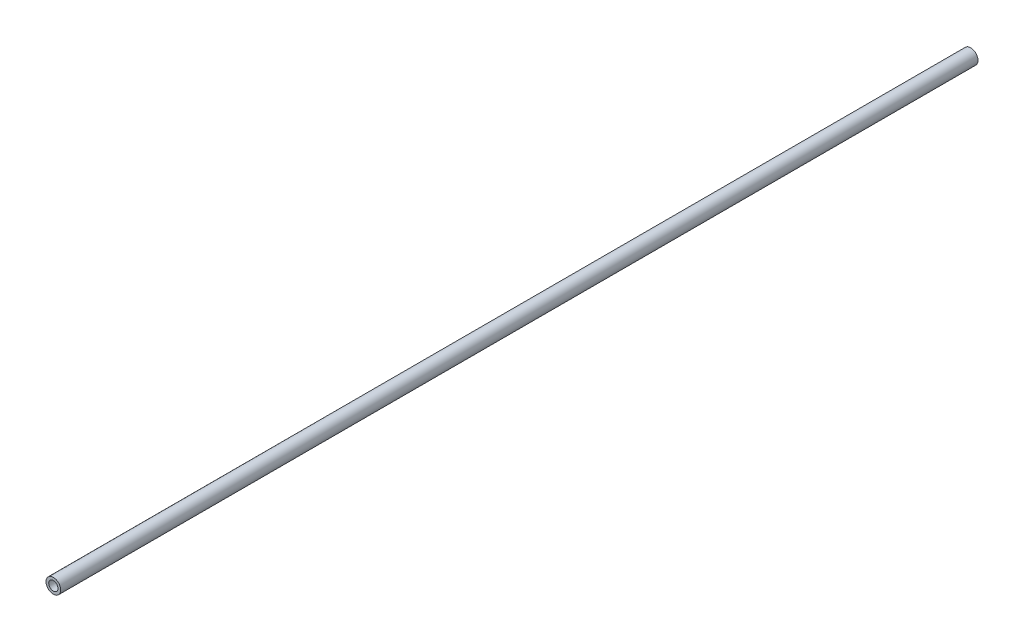
ISO-10303-21;
HEADER;
FILE_DESCRIPTION(('STEP AP214'),'2;1');
FILE_NAME('part.step','',(''),(''),'','','');
FILE_SCHEMA(('AUTOMOTIVE_DESIGN { 1 0 10303 214 1 1 1 1 }'));
ENDSEC;
DATA;
#1=APPLICATION_CONTEXT('core data for automotive mechanical design processes');
#2=APPLICATION_PROTOCOL_DEFINITION('international standard','automotive_design',2000,#1);
#3=PRODUCT_CONTEXT('',#1,'mechanical');
#4=PRODUCT('Part','Part','',(#3));
#5=PRODUCT_RELATED_PRODUCT_CATEGORY('part','',(#4));
#6=PRODUCT_DEFINITION_FORMATION('','',#4);
#7=PRODUCT_DEFINITION_CONTEXT('part definition',#1,'design');
#8=PRODUCT_DEFINITION('design','',#6,#7);
#9=PRODUCT_DEFINITION_SHAPE('','',#8);
#10=(LENGTH_UNIT() NAMED_UNIT(*) SI_UNIT(.MILLI.,.METRE.));
#11=(NAMED_UNIT(*) PLANE_ANGLE_UNIT() SI_UNIT($,.RADIAN.));
#12=(NAMED_UNIT(*) SI_UNIT($,.STERADIAN.) SOLID_ANGLE_UNIT());
#13=UNCERTAINTY_MEASURE_WITH_UNIT(LENGTH_MEASURE(1.E-05),#10,'distance_accuracy_value','');
#14=(GEOMETRIC_REPRESENTATION_CONTEXT(3) GLOBAL_UNCERTAINTY_ASSIGNED_CONTEXT((#13)) GLOBAL_UNIT_ASSIGNED_CONTEXT((#10,
#11,#12)) REPRESENTATION_CONTEXT('',''));
#15=CARTESIAN_POINT('',(0.,0.,0.));
#16=DIRECTION('',(0.,0.,1.));
#17=DIRECTION('',(1.,0.,0.));
#18=AXIS2_PLACEMENT_3D('',#15,#16,#17);
#19=CARTESIAN_POINT('',(0.,0.,298.45));
#20=DIRECTION('',(0.,0.,1.));
#21=DIRECTION('',(1.,0.,0.));
#22=AXIS2_PLACEMENT_3D('',#19,#20,#21);
#23=PLANE('',#22);
#24=CARTESIAN_POINT('',(0.,0.,298.45));
#25=DIRECTION('',(0.,0.,1.));
#26=DIRECTION('',(1.,0.,0.));
#27=AXIS2_PLACEMENT_3D('',#24,#25,#26);
#28=CIRCLE('',#27,2.3876);
#29=CARTESIAN_POINT('',(2.3876,0.,298.45));
#30=VERTEX_POINT('',#29);
#31=EDGE_CURVE('E10',#30,#30,#28,.T.);
#32=ORIENTED_EDGE('',*,*,#31,.T.);
#33=EDGE_LOOP('',(#32));
#34=FACE_BOUND('',#33,.T.);
#35=CARTESIAN_POINT('',(0.,0.,298.45));
#36=DIRECTION('',(0.,0.,1.));
#37=DIRECTION('',(1.,0.,0.));
#38=AXIS2_PLACEMENT_3D('',#35,#36,#37);
#39=CIRCLE('',#38,1.4986);
#40=CARTESIAN_POINT('',(1.4986,0.,298.45));
#41=VERTEX_POINT('',#40);
#42=EDGE_CURVE('E42',#41,#41,#39,.T.);
#43=ORIENTED_EDGE('',*,*,#42,.F.);
#44=EDGE_LOOP('',(#43));
#45=FACE_BOUND('',#44,.T.);
#46=ADVANCED_FACE('F31',(#34,#45),#23,.T.);
#47=CARTESIAN_POINT('',(0.,0.,0.));
#48=DIRECTION('',(0.,0.,1.));
#49=DIRECTION('',(1.,0.,0.));
#50=AXIS2_PLACEMENT_3D('',#47,#48,#49);
#51=PLANE('',#50);
#52=CARTESIAN_POINT('',(0.,0.,0.));
#53=DIRECTION('',(0.,0.,1.));
#54=DIRECTION('',(1.,0.,0.));
#55=AXIS2_PLACEMENT_3D('',#52,#53,#54);
#56=CIRCLE('',#55,2.3876);
#57=CARTESIAN_POINT('',(2.3876,0.,0.));
#58=VERTEX_POINT('',#57);
#59=EDGE_CURVE('E35',#58,#58,#56,.T.);
#60=ORIENTED_EDGE('',*,*,#59,.F.);
#61=EDGE_LOOP('',(#60));
#62=FACE_BOUND('',#61,.T.);
#63=CARTESIAN_POINT('',(0.,0.,0.));
#64=DIRECTION('',(0.,0.,1.));
#65=DIRECTION('',(1.,0.,0.));
#66=AXIS2_PLACEMENT_3D('',#63,#64,#65);
#67=CIRCLE('',#66,1.4986);
#68=CARTESIAN_POINT('',(1.4986,0.,0.));
#69=VERTEX_POINT('',#68);
#70=EDGE_CURVE('E44',#69,#69,#67,.T.);
#71=ORIENTED_EDGE('',*,*,#70,.T.);
#72=EDGE_LOOP('',(#71));
#73=FACE_BOUND('',#72,.T.);
#74=ADVANCED_FACE('F54',(#62,#73),#51,.F.);
#75=CARTESIAN_POINT('',(0.,0.,298.45));
#76=DIRECTION('',(0.,0.,-1.));
#77=DIRECTION('',(-1.,0.,0.));
#78=AXIS2_PLACEMENT_3D('',#75,#76,#77);
#79=CYLINDRICAL_SURFACE('',#78,2.3876);
#80=ORIENTED_EDGE('',*,*,#31,.F.);
#81=EDGE_LOOP('',(#80));
#82=FACE_BOUND('',#81,.T.);
#83=ORIENTED_EDGE('',*,*,#59,.T.);
#84=EDGE_LOOP('',(#83));
#85=FACE_BOUND('',#84,.T.);
#86=ADVANCED_FACE('F33',(#82,#85),#79,.T.);
#87=CARTESIAN_POINT('',(0.,0.,298.45));
#88=DIRECTION('',(0.,0.,-1.));
#89=DIRECTION('',(-1.,0.,0.));
#90=AXIS2_PLACEMENT_3D('',#87,#88,#89);
#91=CYLINDRICAL_SURFACE('',#90,1.4986);
#92=ORIENTED_EDGE('',*,*,#42,.T.);
#93=EDGE_LOOP('',(#92));
#94=FACE_BOUND('',#93,.T.);
#95=ORIENTED_EDGE('',*,*,#70,.F.);
#96=EDGE_LOOP('',(#95));
#97=FACE_BOUND('',#96,.T.);
#98=ADVANCED_FACE('F50',(#94,#97),#91,.F.);
#99=CLOSED_SHELL('',(#46,#74,#86,#98));
#100=MANIFOLD_SOLID_BREP('B2',#99);
#101=ADVANCED_BREP_SHAPE_REPRESENTATION('',(#18,#100),#14);
#102=SHAPE_DEFINITION_REPRESENTATION(#9,#101);
ENDSEC;
END-ISO-10303-21;
